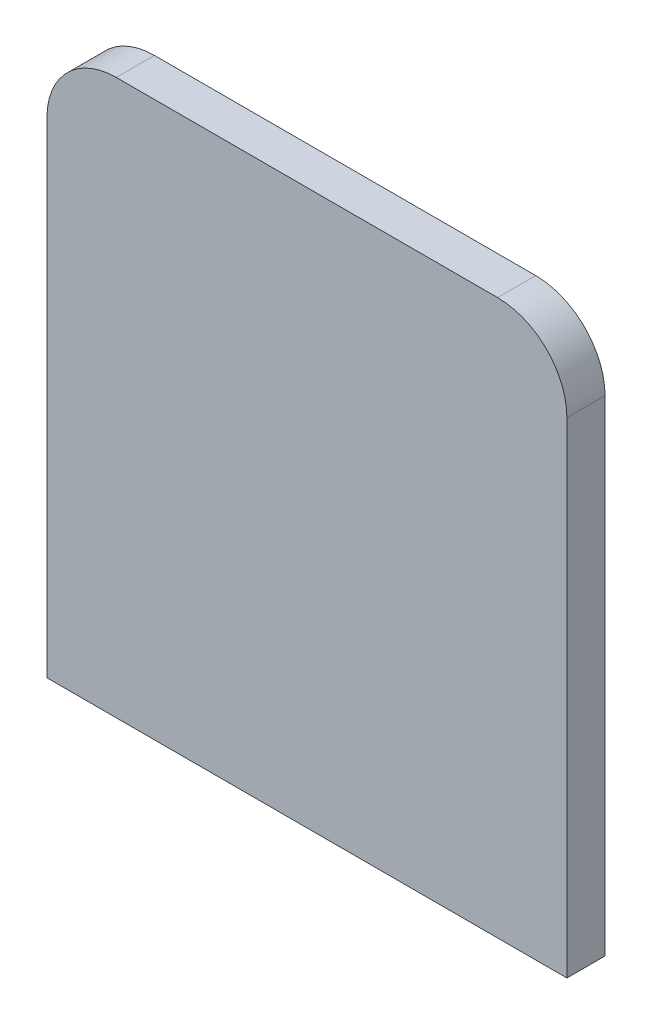
ISO-10303-21;
HEADER;
FILE_DESCRIPTION(('STEP AP214'),'2;1');
FILE_NAME('part.step','',(''),(''),'','','');
FILE_SCHEMA(('AUTOMOTIVE_DESIGN { 1 0 10303 214 1 1 1 1 }'));
ENDSEC;
DATA;
#1=APPLICATION_CONTEXT('core data for automotive mechanical design processes');
#2=APPLICATION_PROTOCOL_DEFINITION('international standard','automotive_design',2000,#1);
#3=PRODUCT_CONTEXT('',#1,'mechanical');
#4=PRODUCT('Part','Part','',(#3));
#5=PRODUCT_RELATED_PRODUCT_CATEGORY('part','',(#4));
#6=PRODUCT_DEFINITION_FORMATION('','',#4);
#7=PRODUCT_DEFINITION_CONTEXT('part definition',#1,'design');
#8=PRODUCT_DEFINITION('design','',#6,#7);
#9=PRODUCT_DEFINITION_SHAPE('','',#8);
#10=(LENGTH_UNIT() NAMED_UNIT(*) SI_UNIT(.MILLI.,.METRE.));
#11=(NAMED_UNIT(*) PLANE_ANGLE_UNIT() SI_UNIT($,.RADIAN.));
#12=(NAMED_UNIT(*) SI_UNIT($,.STERADIAN.) SOLID_ANGLE_UNIT());
#13=UNCERTAINTY_MEASURE_WITH_UNIT(LENGTH_MEASURE(1.E-05),#10,'distance_accuracy_value','');
#14=(GEOMETRIC_REPRESENTATION_CONTEXT(3) GLOBAL_UNCERTAINTY_ASSIGNED_CONTEXT((#13)) GLOBAL_UNIT_ASSIGNED_CONTEXT((#10,
#11,#12)) REPRESENTATION_CONTEXT('',''));
#15=CARTESIAN_POINT('',(0.,0.,0.));
#16=DIRECTION('',(0.,0.,1.));
#17=DIRECTION('',(1.,0.,0.));
#18=AXIS2_PLACEMENT_3D('',#15,#16,#17);
#19=CARTESIAN_POINT('',(-5.5,14.,1.1));
#20=DIRECTION('',(0.,0.,-1.));
#21=DIRECTION('',(-1.,0.,0.));
#22=AXIS2_PLACEMENT_3D('',#19,#20,#21);
#23=CYLINDRICAL_SURFACE('',#22,2.);
#24=CARTESIAN_POINT('',(-5.5,14.,0.));
#25=DIRECTION('',(0.,0.,1.));
#26=DIRECTION('',(1.,0.,0.));
#27=AXIS2_PLACEMENT_3D('',#24,#25,#26);
#28=CIRCLE('',#27,2.);
#29=CARTESIAN_POINT('',(-5.5,16.,0.));
#30=VERTEX_POINT('',#29);
#31=CARTESIAN_POINT('',(-7.5,14.,0.));
#32=VERTEX_POINT('',#31);
#33=EDGE_CURVE('E120',#30,#32,#28,.T.);
#34=ORIENTED_EDGE('',*,*,#33,.T.);
#35=DIRECTION('',(0.,0.,-1.));
#36=VECTOR('',#35,1.);
#37=CARTESIAN_POINT('',(-7.5,14.,1.1));
#38=LINE('',#37,#36);
#39=CARTESIAN_POINT('',(-7.5,14.,1.1));
#40=VERTEX_POINT('',#39);
#41=EDGE_CURVE('E11',#40,#32,#38,.T.);
#42=ORIENTED_EDGE('',*,*,#41,.F.);
#43=CARTESIAN_POINT('',(-5.5,14.,1.1));
#44=DIRECTION('',(0.,0.,1.));
#45=DIRECTION('',(1.,0.,0.));
#46=AXIS2_PLACEMENT_3D('',#43,#44,#45);
#47=CIRCLE('',#46,2.);
#48=CARTESIAN_POINT('',(-5.5,16.,1.1));
#49=VERTEX_POINT('',#48);
#50=EDGE_CURVE('E133',#49,#40,#47,.T.);
#51=ORIENTED_EDGE('',*,*,#50,.F.);
#52=DIRECTION('',(0.,0.,-1.));
#53=VECTOR('',#52,1.);
#54=CARTESIAN_POINT('',(-5.5,16.,1.1));
#55=LINE('',#54,#53);
#56=EDGE_CURVE('E119',#49,#30,#55,.T.);
#57=ORIENTED_EDGE('',*,*,#56,.T.);
#58=EDGE_LOOP('',(#34,#42,#51,#57));
#59=FACE_BOUND('',#58,.T.);
#60=ADVANCED_FACE('F35',(#59),#23,.T.);
#61=CARTESIAN_POINT('',(-7.5,14.,1.1));
#62=DIRECTION('',(1.,0.,0.));
#63=DIRECTION('',(0.,0.,-1.));
#64=AXIS2_PLACEMENT_3D('',#61,#62,#63);
#65=PLANE('',#64);
#66=DIRECTION('',(0.,-1.,0.));
#67=VECTOR('',#66,1.);
#68=CARTESIAN_POINT('',(-7.5,14.,0.));
#69=LINE('',#68,#67);
#70=CARTESIAN_POINT('',(-7.5,0.,0.));
#71=VERTEX_POINT('',#70);
#72=EDGE_CURVE('E123',#32,#71,#69,.T.);
#73=ORIENTED_EDGE('',*,*,#72,.T.);
#74=DIRECTION('',(0.,0.,-1.));
#75=VECTOR('',#74,1.);
#76=CARTESIAN_POINT('',(-7.5,0.,1.1));
#77=LINE('',#76,#75);
#78=CARTESIAN_POINT('',(-7.5,0.,1.1));
#79=VERTEX_POINT('',#78);
#80=EDGE_CURVE('E43',#79,#71,#77,.T.);
#81=ORIENTED_EDGE('',*,*,#80,.F.);
#82=DIRECTION('',(0.,-1.,0.));
#83=VECTOR('',#82,1.);
#84=CARTESIAN_POINT('',(-7.5,14.,1.1));
#85=LINE('',#84,#83);
#86=EDGE_CURVE('E85',#40,#79,#85,.T.);
#87=ORIENTED_EDGE('',*,*,#86,.F.);
#88=ORIENTED_EDGE('',*,*,#41,.T.);
#89=EDGE_LOOP('',(#73,#81,#87,#88));
#90=FACE_BOUND('',#89,.T.);
#91=ADVANCED_FACE('F139',(#90),#65,.F.);
#92=CARTESIAN_POINT('',(0.,0.,1.1));
#93=DIRECTION('',(0.,1.,0.));
#94=DIRECTION('',(0.,0.,1.));
#95=AXIS2_PLACEMENT_3D('',#92,#93,#94);
#96=PLANE('',#95);
#97=DIRECTION('',(1.,0.,0.));
#98=VECTOR('',#97,1.);
#99=CARTESIAN_POINT('',(0.,0.,0.));
#100=LINE('',#99,#98);
#101=CARTESIAN_POINT('',(7.50000000000001,0.,0.));
#102=VERTEX_POINT('',#101);
#103=EDGE_CURVE('E126',#71,#102,#100,.T.);
#104=ORIENTED_EDGE('',*,*,#103,.T.);
#105=DIRECTION('',(0.,0.,-1.));
#106=VECTOR('',#105,1.);
#107=CARTESIAN_POINT('',(7.50000000000001,0.,1.1));
#108=LINE('',#107,#106);
#109=CARTESIAN_POINT('',(7.50000000000001,0.,1.1));
#110=VERTEX_POINT('',#109);
#111=EDGE_CURVE('E103',#110,#102,#108,.T.);
#112=ORIENTED_EDGE('',*,*,#111,.F.);
#113=DIRECTION('',(-1.,0.,0.));
#114=VECTOR('',#113,1.);
#115=CARTESIAN_POINT('',(0.,0.,1.1));
#116=LINE('',#115,#114);
#117=EDGE_CURVE('E112',#110,#79,#116,.T.);
#118=ORIENTED_EDGE('',*,*,#117,.T.);
#119=ORIENTED_EDGE('',*,*,#80,.T.);
#120=EDGE_LOOP('',(#104,#112,#118,#119));
#121=FACE_BOUND('',#120,.T.);
#122=ADVANCED_FACE('F138',(#121),#96,.F.);
#123=CARTESIAN_POINT('',(7.50000000000001,14.,1.1));
#124=DIRECTION('',(1.,0.,0.));
#125=DIRECTION('',(0.,0.,-1.));
#126=AXIS2_PLACEMENT_3D('',#123,#124,#125);
#127=PLANE('',#126);
#128=DIRECTION('',(0.,-1.,0.));
#129=VECTOR('',#128,1.);
#130=CARTESIAN_POINT('',(7.50000000000001,14.,0.));
#131=LINE('',#130,#129);
#132=CARTESIAN_POINT('',(7.50000000000001,14.,0.));
#133=VERTEX_POINT('',#132);
#134=EDGE_CURVE('E100',#133,#102,#131,.T.);
#135=ORIENTED_EDGE('',*,*,#134,.F.);
#136=DIRECTION('',(0.,0.,-1.));
#137=VECTOR('',#136,1.);
#138=CARTESIAN_POINT('',(7.50000000000001,14.,1.1));
#139=LINE('',#138,#137);
#140=CARTESIAN_POINT('',(7.50000000000001,14.,1.1));
#141=VERTEX_POINT('',#140);
#142=EDGE_CURVE('E94',#141,#133,#139,.T.);
#143=ORIENTED_EDGE('',*,*,#142,.F.);
#144=DIRECTION('',(0.,-1.,0.));
#145=VECTOR('',#144,1.);
#146=CARTESIAN_POINT('',(7.50000000000001,14.,1.1));
#147=LINE('',#146,#145);
#148=EDGE_CURVE('E98',#141,#110,#147,.T.);
#149=ORIENTED_EDGE('',*,*,#148,.T.);
#150=ORIENTED_EDGE('',*,*,#111,.T.);
#151=EDGE_LOOP('',(#135,#143,#149,#150));
#152=FACE_BOUND('',#151,.T.);
#153=ADVANCED_FACE('F96',(#152),#127,.T.);
#154=CARTESIAN_POINT('',(5.50000000000001,14.,1.1));
#155=DIRECTION('',(0.,0.,-1.));
#156=DIRECTION('',(-1.,0.,0.));
#157=AXIS2_PLACEMENT_3D('',#154,#155,#156);
#158=CYLINDRICAL_SURFACE('',#157,2.);
#159=CARTESIAN_POINT('',(5.50000000000001,14.,0.));
#160=DIRECTION('',(0.,0.,1.));
#161=DIRECTION('',(1.,0.,0.));
#162=AXIS2_PLACEMENT_3D('',#159,#160,#161);
#163=CIRCLE('',#162,2.);
#164=CARTESIAN_POINT('',(5.50000000000001,16.,0.));
#165=VERTEX_POINT('',#164);
#166=EDGE_CURVE('E130',#133,#165,#163,.T.);
#167=ORIENTED_EDGE('',*,*,#166,.T.);
#168=DIRECTION('',(0.,0.,-1.));
#169=VECTOR('',#168,1.);
#170=CARTESIAN_POINT('',(5.50000000000001,16.,1.1));
#171=LINE('',#170,#169);
#172=CARTESIAN_POINT('',(5.50000000000001,16.,1.1));
#173=VERTEX_POINT('',#172);
#174=EDGE_CURVE('E104',#173,#165,#171,.T.);
#175=ORIENTED_EDGE('',*,*,#174,.F.);
#176=CARTESIAN_POINT('',(5.50000000000001,14.,1.1));
#177=DIRECTION('',(0.,0.,1.));
#178=DIRECTION('',(1.,0.,0.));
#179=AXIS2_PLACEMENT_3D('',#176,#177,#178);
#180=CIRCLE('',#179,2.);
#181=EDGE_CURVE('E107',#141,#173,#180,.T.);
#182=ORIENTED_EDGE('',*,*,#181,.F.);
#183=ORIENTED_EDGE('',*,*,#142,.T.);
#184=EDGE_LOOP('',(#167,#175,#182,#183));
#185=FACE_BOUND('',#184,.T.);
#186=ADVANCED_FACE('F108',(#185),#158,.T.);
#187=CARTESIAN_POINT('',(0.,16.,1.1));
#188=DIRECTION('',(0.,-1.,0.));
#189=DIRECTION('',(0.,0.,-1.));
#190=AXIS2_PLACEMENT_3D('',#187,#188,#189);
#191=PLANE('',#190);
#192=DIRECTION('',(-1.,0.,0.));
#193=VECTOR('',#192,1.);
#194=CARTESIAN_POINT('',(0.,16.,0.));
#195=LINE('',#194,#193);
#196=EDGE_CURVE('E74',#165,#30,#195,.T.);
#197=ORIENTED_EDGE('',*,*,#196,.T.);
#198=ORIENTED_EDGE('',*,*,#56,.F.);
#199=DIRECTION('',(1.,0.,0.));
#200=VECTOR('',#199,1.);
#201=CARTESIAN_POINT('',(0.,16.,1.1));
#202=LINE('',#201,#200);
#203=EDGE_CURVE('E51',#49,#173,#202,.T.);
#204=ORIENTED_EDGE('',*,*,#203,.T.);
#205=ORIENTED_EDGE('',*,*,#174,.T.);
#206=EDGE_LOOP('',(#197,#198,#204,#205));
#207=FACE_BOUND('',#206,.T.);
#208=ADVANCED_FACE('F144',(#207),#191,.F.);
#209=CARTESIAN_POINT('',(-5.5,14.,1.1));
#210=DIRECTION('',(0.,0.,1.));
#211=DIRECTION('',(1.,0.,0.));
#212=AXIS2_PLACEMENT_3D('',#209,#210,#211);
#213=PLANE('',#212);
#214=ORIENTED_EDGE('',*,*,#50,.T.);
#215=ORIENTED_EDGE('',*,*,#86,.T.);
#216=ORIENTED_EDGE('',*,*,#117,.F.);
#217=ORIENTED_EDGE('',*,*,#148,.F.);
#218=ORIENTED_EDGE('',*,*,#181,.T.);
#219=ORIENTED_EDGE('',*,*,#203,.F.);
#220=EDGE_LOOP('',(#214,#215,#216,#217,#218,#219));
#221=FACE_BOUND('',#220,.T.);
#222=ADVANCED_FACE('F110',(#221),#213,.T.);
#223=CARTESIAN_POINT('',(-5.5,14.,0.));
#224=DIRECTION('',(0.,0.,1.));
#225=DIRECTION('',(1.,0.,0.));
#226=AXIS2_PLACEMENT_3D('',#223,#224,#225);
#227=PLANE('',#226);
#228=ORIENTED_EDGE('',*,*,#33,.F.);
#229=ORIENTED_EDGE('',*,*,#196,.F.);
#230=ORIENTED_EDGE('',*,*,#166,.F.);
#231=ORIENTED_EDGE('',*,*,#134,.T.);
#232=ORIENTED_EDGE('',*,*,#103,.F.);
#233=ORIENTED_EDGE('',*,*,#72,.F.);
#234=EDGE_LOOP('',(#228,#229,#230,#231,#232,#233));
#235=FACE_BOUND('',#234,.T.);
#236=ADVANCED_FACE('F141',(#235),#227,.F.);
#237=CLOSED_SHELL('',(#60,#91,#122,#153,#186,#208,#222,#236));
#238=MANIFOLD_SOLID_BREP('B2',#237);
#239=ADVANCED_BREP_SHAPE_REPRESENTATION('',(#18,#238),#14);
#240=SHAPE_DEFINITION_REPRESENTATION(#9,#239);
ENDSEC;
END-ISO-10303-21;
